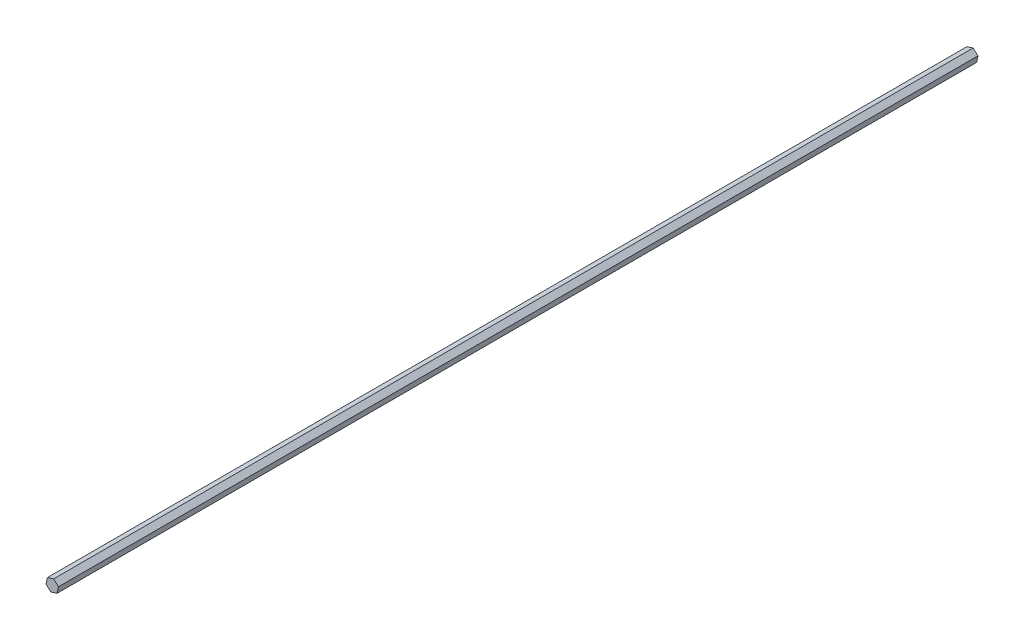
ISO-10303-21;
HEADER;
FILE_DESCRIPTION(('STEP AP214'),'2;1');
FILE_NAME('part.step','',(''),(''),'','','');
FILE_SCHEMA(('AUTOMOTIVE_DESIGN { 1 0 10303 214 1 1 1 1 }'));
ENDSEC;
DATA;
#1=APPLICATION_CONTEXT('core data for automotive mechanical design processes');
#2=APPLICATION_PROTOCOL_DEFINITION('international standard','automotive_design',2000,#1);
#3=PRODUCT_CONTEXT('',#1,'mechanical');
#4=PRODUCT('Part','Part','',(#3));
#5=PRODUCT_RELATED_PRODUCT_CATEGORY('part','',(#4));
#6=PRODUCT_DEFINITION_FORMATION('','',#4);
#7=PRODUCT_DEFINITION_CONTEXT('part definition',#1,'design');
#8=PRODUCT_DEFINITION('design','',#6,#7);
#9=PRODUCT_DEFINITION_SHAPE('','',#8);
#10=(LENGTH_UNIT() NAMED_UNIT(*) SI_UNIT(.MILLI.,.METRE.));
#11=(NAMED_UNIT(*) PLANE_ANGLE_UNIT() SI_UNIT($,.RADIAN.));
#12=(NAMED_UNIT(*) SI_UNIT($,.STERADIAN.) SOLID_ANGLE_UNIT());
#13=UNCERTAINTY_MEASURE_WITH_UNIT(LENGTH_MEASURE(1.E-05),#10,'distance_accuracy_value','');
#14=(GEOMETRIC_REPRESENTATION_CONTEXT(3) GLOBAL_UNCERTAINTY_ASSIGNED_CONTEXT((#13)) GLOBAL_UNIT_ASSIGNED_CONTEXT((#10,
#11,#12)) REPRESENTATION_CONTEXT('',''));
#15=CARTESIAN_POINT('',(0.,0.,0.));
#16=DIRECTION('',(0.,0.,1.));
#17=DIRECTION('',(1.,0.,0.));
#18=AXIS2_PLACEMENT_3D('',#15,#16,#17);
#19=CARTESIAN_POINT('',(-0.61182187926995,-2.82117126764399,405.));
#20=DIRECTION('',(-0.305094633460301,0.952322038300976,0.));
#21=DIRECTION('',(-0.952322038300976,-0.305094633460301,0.));
#22=AXIS2_PLACEMENT_3D('',#19,#20,#21);
#23=PLANE('',#22);
#24=DIRECTION('',(0.952322038300976,0.305094633460301,0.));
#25=VECTOR('',#24,1.);
#26=CARTESIAN_POINT('',(-0.61182187926995,-2.82117126764399,0.));
#27=LINE('',#26,#25);
#28=CARTESIAN_POINT('',(-0.61182187926995,-2.82117126764399,0.));
#29=VERTEX_POINT('',#28);
#30=CARTESIAN_POINT('',(2.13729504657146,-1.94043892386091,0.));
#31=VERTEX_POINT('',#30);
#32=EDGE_CURVE('E118',#29,#31,#27,.T.);
#33=ORIENTED_EDGE('',*,*,#32,.T.);
#34=DIRECTION('',(0.,0.,-1.));
#35=VECTOR('',#34,1.);
#36=CARTESIAN_POINT('',(2.13729504657146,-1.94043892386091,405.));
#37=LINE('',#36,#35);
#38=CARTESIAN_POINT('',(2.13729504657146,-1.94043892386091,405.));
#39=VERTEX_POINT('',#38);
#40=EDGE_CURVE('E11',#39,#31,#37,.T.);
#41=ORIENTED_EDGE('',*,*,#40,.F.);
#42=DIRECTION('',(0.952322038300976,0.305094633460301,0.));
#43=VECTOR('',#42,1.);
#44=CARTESIAN_POINT('',(-0.61182187926995,-2.82117126764399,405.));
#45=LINE('',#44,#43);
#46=CARTESIAN_POINT('',(-0.61182187926995,-2.82117126764399,405.));
#47=VERTEX_POINT('',#46);
#48=EDGE_CURVE('E128',#47,#39,#45,.T.);
#49=ORIENTED_EDGE('',*,*,#48,.F.);
#50=DIRECTION('',(0.,0.,-1.));
#51=VECTOR('',#50,1.);
#52=CARTESIAN_POINT('',(-0.61182187926995,-2.82117126764399,405.));
#53=LINE('',#52,#51);
#54=EDGE_CURVE('E114',#47,#29,#53,.T.);
#55=ORIENTED_EDGE('',*,*,#54,.T.);
#56=EDGE_LOOP('',(#33,#41,#49,#55));
#57=FACE_BOUND('',#56,.T.);
#58=ADVANCED_FACE('F34',(#57),#23,.F.);
#59=CARTESIAN_POINT('',(2.13729504657146,-1.94043892386091,405.));
#60=DIRECTION('',(-0.977282394482572,0.211941316015566,0.));
#61=DIRECTION('',(-0.211941316015566,-0.977282394482572,0.));
#62=AXIS2_PLACEMENT_3D('',#59,#60,#61);
#63=PLANE('',#62);
#64=DIRECTION('',(0.211941316015566,0.977282394482572,0.));
#65=VECTOR('',#64,1.);
#66=CARTESIAN_POINT('',(2.13729504657146,-1.94043892386091,0.));
#67=LINE('',#66,#65);
#68=CARTESIAN_POINT('',(2.74911692584142,0.880732343783076,0.));
#69=VERTEX_POINT('',#68);
#70=EDGE_CURVE('E121',#31,#69,#67,.T.);
#71=ORIENTED_EDGE('',*,*,#70,.T.);
#72=DIRECTION('',(0.,0.,-1.));
#73=VECTOR('',#72,1.);
#74=CARTESIAN_POINT('',(2.74911692584142,0.880732343783076,405.));
#75=LINE('',#74,#73);
#76=CARTESIAN_POINT('',(2.74911692584142,0.880732343783076,405.));
#77=VERTEX_POINT('',#76);
#78=EDGE_CURVE('E42',#77,#69,#75,.T.);
#79=ORIENTED_EDGE('',*,*,#78,.F.);
#80=DIRECTION('',(0.211941316015566,0.977282394482572,0.));
#81=VECTOR('',#80,1.);
#82=CARTESIAN_POINT('',(2.13729504657146,-1.94043892386091,405.));
#83=LINE('',#82,#81);
#84=EDGE_CURVE('E87',#39,#77,#83,.T.);
#85=ORIENTED_EDGE('',*,*,#84,.F.);
#86=ORIENTED_EDGE('',*,*,#40,.T.);
#87=EDGE_LOOP('',(#71,#79,#85,#86));
#88=FACE_BOUND('',#87,.T.);
#89=ADVANCED_FACE('F152',(#88),#63,.F.);
#90=CARTESIAN_POINT('',(2.74911692584142,0.880732343783076,405.));
#91=DIRECTION('',(-0.672187761022271,-0.740380722285411,0.));
#92=DIRECTION('',(0.740380722285411,-0.672187761022271,0.));
#93=AXIS2_PLACEMENT_3D('',#90,#91,#92);
#94=PLANE('',#93);
#95=DIRECTION('',(-0.74038072228541,0.672187761022271,0.));
#96=VECTOR('',#95,1.);
#97=CARTESIAN_POINT('',(2.74911692584142,0.880732343783076,0.));
#98=LINE('',#97,#96);
#99=CARTESIAN_POINT('',(0.611821879269952,2.82117126764399,0.));
#100=VERTEX_POINT('',#99);
#101=EDGE_CURVE('E123',#69,#100,#98,.T.);
#102=ORIENTED_EDGE('',*,*,#101,.T.);
#103=DIRECTION('',(0.,0.,-1.));
#104=VECTOR('',#103,1.);
#105=CARTESIAN_POINT('',(0.611821879269952,2.82117126764399,405.));
#106=LINE('',#105,#104);
#107=CARTESIAN_POINT('',(0.611821879269952,2.82117126764399,405.));
#108=VERTEX_POINT('',#107);
#109=EDGE_CURVE('E109',#108,#100,#106,.T.);
#110=ORIENTED_EDGE('',*,*,#109,.F.);
#111=DIRECTION('',(-0.74038072228541,0.672187761022271,0.));
#112=VECTOR('',#111,1.);
#113=CARTESIAN_POINT('',(2.74911692584142,0.880732343783076,405.));
#114=LINE('',#113,#112);
#115=EDGE_CURVE('E100',#77,#108,#114,.T.);
#116=ORIENTED_EDGE('',*,*,#115,.F.);
#117=ORIENTED_EDGE('',*,*,#78,.T.);
#118=EDGE_LOOP('',(#102,#110,#116,#117));
#119=FACE_BOUND('',#118,.T.);
#120=ADVANCED_FACE('F134',(#119),#94,.F.);
#121=CARTESIAN_POINT('',(0.611821879269952,2.82117126764399,405.));
#122=DIRECTION('',(0.305094633460301,-0.952322038300976,0.));
#123=DIRECTION('',(0.952322038300976,0.305094633460301,0.));
#124=AXIS2_PLACEMENT_3D('',#121,#122,#123);
#125=PLANE('',#124);
#126=DIRECTION('',(-0.952322038300976,-0.305094633460301,0.));
#127=VECTOR('',#126,1.);
#128=CARTESIAN_POINT('',(0.611821879269952,2.82117126764399,0.));
#129=LINE('',#128,#127);
#130=CARTESIAN_POINT('',(-2.13729504657146,1.94043892386091,0.));
#131=VERTEX_POINT('',#130);
#132=EDGE_CURVE('E108',#100,#131,#129,.T.);
#133=ORIENTED_EDGE('',*,*,#132,.T.);
#134=DIRECTION('',(0.,0.,-1.));
#135=VECTOR('',#134,1.);
#136=CARTESIAN_POINT('',(-2.13729504657146,1.94043892386091,405.));
#137=LINE('',#136,#135);
#138=CARTESIAN_POINT('',(-2.13729504657146,1.94043892386091,405.));
#139=VERTEX_POINT('',#138);
#140=EDGE_CURVE('E105',#139,#131,#137,.T.);
#141=ORIENTED_EDGE('',*,*,#140,.F.);
#142=DIRECTION('',(-0.952322038300976,-0.305094633460301,0.));
#143=VECTOR('',#142,1.);
#144=CARTESIAN_POINT('',(0.611821879269952,2.82117126764399,405.));
#145=LINE('',#144,#143);
#146=EDGE_CURVE('E94',#108,#139,#145,.T.);
#147=ORIENTED_EDGE('',*,*,#146,.F.);
#148=ORIENTED_EDGE('',*,*,#109,.T.);
#149=EDGE_LOOP('',(#133,#141,#147,#148));
#150=FACE_BOUND('',#149,.T.);
#151=ADVANCED_FACE('F106',(#150),#125,.F.);
#152=CARTESIAN_POINT('',(-2.13729504657146,1.94043892386091,405.));
#153=DIRECTION('',(0.977282394482572,-0.211941316015565,0.));
#154=DIRECTION('',(0.211941316015565,0.977282394482572,0.));
#155=AXIS2_PLACEMENT_3D('',#152,#153,#154);
#156=PLANE('',#155);
#157=DIRECTION('',(-0.211941316015565,-0.977282394482572,0.));
#158=VECTOR('',#157,1.);
#159=CARTESIAN_POINT('',(-2.13729504657146,1.94043892386091,0.));
#160=LINE('',#159,#158);
#161=CARTESIAN_POINT('',(-2.74911692584141,-0.88073234378308,0.));
#162=VERTEX_POINT('',#161);
#163=EDGE_CURVE('E73',#131,#162,#160,.T.);
#164=ORIENTED_EDGE('',*,*,#163,.T.);
#165=DIRECTION('',(0.,0.,-1.));
#166=VECTOR('',#165,1.);
#167=CARTESIAN_POINT('',(-2.74911692584141,-0.88073234378308,405.));
#168=LINE('',#167,#166);
#169=CARTESIAN_POINT('',(-2.74911692584141,-0.88073234378308,405.));
#170=VERTEX_POINT('',#169);
#171=EDGE_CURVE('E110',#170,#162,#168,.T.);
#172=ORIENTED_EDGE('',*,*,#171,.F.);
#173=DIRECTION('',(-0.211941316015565,-0.977282394482572,0.));
#174=VECTOR('',#173,1.);
#175=CARTESIAN_POINT('',(-2.13729504657146,1.94043892386091,405.));
#176=LINE('',#175,#174);
#177=EDGE_CURVE('E98',#139,#170,#176,.T.);
#178=ORIENTED_EDGE('',*,*,#177,.F.);
#179=ORIENTED_EDGE('',*,*,#140,.T.);
#180=EDGE_LOOP('',(#164,#172,#178,#179));
#181=FACE_BOUND('',#180,.T.);
#182=ADVANCED_FACE('F112',(#181),#156,.F.);
#183=CARTESIAN_POINT('',(-2.74911692584141,-0.88073234378308,405.));
#184=DIRECTION('',(0.672187761022271,0.740380722285411,0.));
#185=DIRECTION('',(-0.740380722285411,0.672187761022271,0.));
#186=AXIS2_PLACEMENT_3D('',#183,#184,#185);
#187=PLANE('',#186);
#188=DIRECTION('',(0.740380722285411,-0.672187761022271,0.));
#189=VECTOR('',#188,1.);
#190=CARTESIAN_POINT('',(-2.74911692584141,-0.88073234378308,0.));
#191=LINE('',#190,#189);
#192=EDGE_CURVE('E79',#162,#29,#191,.T.);
#193=ORIENTED_EDGE('',*,*,#192,.T.);
#194=ORIENTED_EDGE('',*,*,#54,.F.);
#195=DIRECTION('',(0.740380722285411,-0.672187761022271,0.));
#196=VECTOR('',#195,1.);
#197=CARTESIAN_POINT('',(-2.74911692584141,-0.88073234378308,405.));
#198=LINE('',#197,#196);
#199=EDGE_CURVE('E50',#170,#47,#198,.T.);
#200=ORIENTED_EDGE('',*,*,#199,.F.);
#201=ORIENTED_EDGE('',*,*,#171,.T.);
#202=EDGE_LOOP('',(#193,#194,#200,#201));
#203=FACE_BOUND('',#202,.T.);
#204=ADVANCED_FACE('F141',(#203),#187,.F.);
#205=CARTESIAN_POINT('',(0.,0.,405.));
#206=DIRECTION('',(0.,0.,1.));
#207=DIRECTION('',(1.,0.,0.));
#208=AXIS2_PLACEMENT_3D('',#205,#206,#207);
#209=PLANE('',#208);
#210=ORIENTED_EDGE('',*,*,#48,.T.);
#211=ORIENTED_EDGE('',*,*,#84,.T.);
#212=ORIENTED_EDGE('',*,*,#115,.T.);
#213=ORIENTED_EDGE('',*,*,#146,.T.);
#214=ORIENTED_EDGE('',*,*,#177,.T.);
#215=ORIENTED_EDGE('',*,*,#199,.T.);
#216=EDGE_LOOP('',(#210,#211,#212,#213,#214,#215));
#217=FACE_BOUND('',#216,.T.);
#218=ADVANCED_FACE('F96',(#217),#209,.T.);
#219=CARTESIAN_POINT('',(0.,0.,0.));
#220=DIRECTION('',(0.,0.,1.));
#221=DIRECTION('',(1.,0.,0.));
#222=AXIS2_PLACEMENT_3D('',#219,#220,#221);
#223=PLANE('',#222);
#224=ORIENTED_EDGE('',*,*,#32,.F.);
#225=ORIENTED_EDGE('',*,*,#192,.F.);
#226=ORIENTED_EDGE('',*,*,#163,.F.);
#227=ORIENTED_EDGE('',*,*,#132,.F.);
#228=ORIENTED_EDGE('',*,*,#101,.F.);
#229=ORIENTED_EDGE('',*,*,#70,.F.);
#230=EDGE_LOOP('',(#224,#225,#226,#227,#228,#229));
#231=FACE_BOUND('',#230,.T.);
#232=ADVANCED_FACE('F137',(#231),#223,.F.);
#233=CLOSED_SHELL('',(#58,#89,#120,#151,#182,#204,#218,#232));
#234=MANIFOLD_SOLID_BREP('B2',#233);
#235=ADVANCED_BREP_SHAPE_REPRESENTATION('',(#18,#234),#14);
#236=SHAPE_DEFINITION_REPRESENTATION(#9,#235);
ENDSEC;
END-ISO-10303-21;
